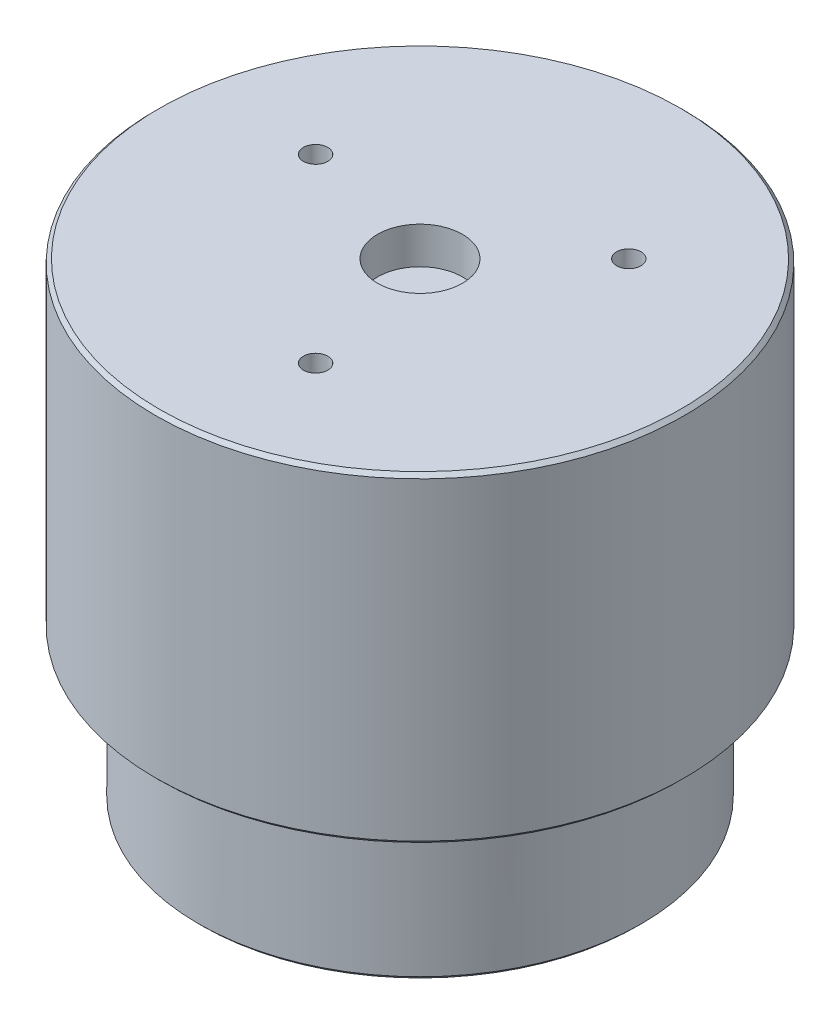
ISO-10303-21;
HEADER;
FILE_DESCRIPTION(('STEP AP214'),'2;1');
FILE_NAME('part.step','',(''),(''),'','','');
FILE_SCHEMA(('AUTOMOTIVE_DESIGN { 1 0 10303 214 1 1 1 1 }'));
ENDSEC;
DATA;
#1=APPLICATION_CONTEXT('core data for automotive mechanical design processes');
#2=APPLICATION_PROTOCOL_DEFINITION('international standard','automotive_design',2000,#1);
#3=PRODUCT_CONTEXT('',#1,'mechanical');
#4=PRODUCT('Part','Part','',(#3));
#5=PRODUCT_RELATED_PRODUCT_CATEGORY('part','',(#4));
#6=PRODUCT_DEFINITION_FORMATION('','',#4);
#7=PRODUCT_DEFINITION_CONTEXT('part definition',#1,'design');
#8=PRODUCT_DEFINITION('design','',#6,#7);
#9=PRODUCT_DEFINITION_SHAPE('','',#8);
#10=(LENGTH_UNIT() NAMED_UNIT(*) SI_UNIT(.MILLI.,.METRE.));
#11=(NAMED_UNIT(*) PLANE_ANGLE_UNIT() SI_UNIT($,.RADIAN.));
#12=(NAMED_UNIT(*) SI_UNIT($,.STERADIAN.) SOLID_ANGLE_UNIT());
#13=UNCERTAINTY_MEASURE_WITH_UNIT(LENGTH_MEASURE(1.E-05),#10,'distance_accuracy_value','');
#14=(GEOMETRIC_REPRESENTATION_CONTEXT(3) GLOBAL_UNCERTAINTY_ASSIGNED_CONTEXT((#13)) GLOBAL_UNIT_ASSIGNED_CONTEXT((#10,
#11,#12)) REPRESENTATION_CONTEXT('',''));
#15=CARTESIAN_POINT('',(0.,0.,0.));
#16=DIRECTION('',(0.,0.,1.));
#17=DIRECTION('',(1.,0.,0.));
#18=AXIS2_PLACEMENT_3D('',#15,#16,#17);
#19=CARTESIAN_POINT('',(0.,18.900368705809,-29.5));
#20=DIRECTION('',(0.,-1.,0.));
#21=DIRECTION('',(0.,0.,-1.));
#22=AXIS2_PLACEMENT_3D('',#19,#20,#21);
#23=PLANE('',#22);
#24=CARTESIAN_POINT('',(0.,18.900368705809,0.));
#25=DIRECTION('',(0.,1.,0.));
#26=DIRECTION('',(0.,0.,1.));
#27=AXIS2_PLACEMENT_3D('',#24,#25,#26);
#28=CIRCLE('',#27,29.5);
#29=CARTESIAN_POINT('',(0.,18.900368705809,29.5));
#30=VERTEX_POINT('',#29);
#31=EDGE_CURVE('E20',#30,#30,#28,.T.);
#32=ORIENTED_EDGE('',*,*,#31,.F.);
#33=EDGE_LOOP('',(#32));
#34=FACE_BOUND('',#33,.T.);
#35=ADVANCED_FACE('F17',(#34),#23,.T.);
#36=CARTESIAN_POINT('',(-19.3155992095119,70.900368705793,-5.17559920951214));
#37=DIRECTION('',(0.,1.,0.));
#38=DIRECTION('',(0.,0.,1.));
#39=AXIS2_PLACEMENT_3D('',#36,#37,#38);
#40=CONICAL_SURFACE('',#39,1.65000000004454,1.02974425870138);
#41=CARTESIAN_POINT('',(-19.3155992095119,69.9089486844287,-5.17559920951214));
#42=VERTEX_POINT('',#41);
#43=VERTEX_LOOP('',#42);
#44=FACE_BOUND('',#43,.T.);
#45=CARTESIAN_POINT('',(-19.3155992095119,70.900368705809,-5.17559920951214));
#46=DIRECTION('',(0.,1.,0.));
#47=DIRECTION('',(0.,0.,1.));
#48=AXIS2_PLACEMENT_3D('',#45,#46,#47);
#49=CIRCLE('',#48,1.65);
#50=CARTESIAN_POINT('',(-19.3155992095119,70.900368705809,-3.52559920951214));
#51=VERTEX_POINT('',#50);
#52=EDGE_CURVE('E42',#51,#51,#49,.T.);
#53=ORIENTED_EDGE('',*,*,#52,.T.);
#54=EDGE_LOOP('',(#53));
#55=FACE_BOUND('',#54,.T.);
#56=ADVANCED_FACE('F36',(#44,#55),#40,.F.);
#57=CARTESIAN_POINT('',(5.17559920951187,70.900368705793,19.315599209512));
#58=DIRECTION('',(0.,1.,0.));
#59=DIRECTION('',(0.,0.,1.));
#60=AXIS2_PLACEMENT_3D('',#57,#58,#59);
#61=CONICAL_SURFACE('',#60,1.64999999997749,1.02974425867096);
#62=CARTESIAN_POINT('',(5.17559920951187,69.9089486844002,19.3155992094551));
#63=VERTEX_POINT('',#62);
#64=VERTEX_LOOP('',#63);
#65=FACE_BOUND('',#64,.T.);
#66=CARTESIAN_POINT('',(5.17559920951187,70.900368705809,19.315599209512));
#67=DIRECTION('',(0.,1.,0.));
#68=DIRECTION('',(0.,0.,1.));
#69=AXIS2_PLACEMENT_3D('',#66,#67,#68);
#70=CIRCLE('',#69,1.65);
#71=CARTESIAN_POINT('',(5.17559920951187,70.900368705809,20.965599209512));
#72=VERTEX_POINT('',#71);
#73=EDGE_CURVE('E44',#72,#72,#70,.T.);
#74=ORIENTED_EDGE('',*,*,#73,.T.);
#75=EDGE_LOOP('',(#74));
#76=FACE_BOUND('',#75,.T.);
#77=ADVANCED_FACE('F39',(#65,#76),#61,.F.);
#78=CARTESIAN_POINT('',(14.14,70.900368705793,-14.14));
#79=DIRECTION('',(0.,1.,0.));
#80=DIRECTION('',(0.,0.,1.));
#81=AXIS2_PLACEMENT_3D('',#78,#79,#80);
#82=CONICAL_SURFACE('',#81,1.65000000004297,1.02974425867096);
#83=CARTESIAN_POINT('',(14.14,69.9089486843718,-14.1400000001137));
#84=VERTEX_POINT('',#83);
#85=VERTEX_LOOP('',#84);
#86=FACE_BOUND('',#85,.T.);
#87=CARTESIAN_POINT('',(14.14,70.900368705809,-14.14));
#88=DIRECTION('',(0.,1.,0.));
#89=DIRECTION('',(0.,0.,1.));
#90=AXIS2_PLACEMENT_3D('',#87,#88,#89);
#91=CIRCLE('',#90,1.65);
#92=CARTESIAN_POINT('',(14.14,70.900368705809,-12.49));
#93=VERTEX_POINT('',#92);
#94=EDGE_CURVE('E47',#93,#93,#91,.T.);
#95=ORIENTED_EDGE('',*,*,#94,.T.);
#96=EDGE_LOOP('',(#95));
#97=FACE_BOUND('',#96,.T.);
#98=ADVANCED_FACE('F285',(#86,#97),#82,.F.);
#99=CARTESIAN_POINT('',(0.,77.400368705809,0.));
#100=DIRECTION('',(0.,1.,0.));
#101=DIRECTION('',(0.,0.,1.));
#102=AXIS2_PLACEMENT_3D('',#99,#100,#101);
#103=PLANE('',#102);
#104=CARTESIAN_POINT('',(0.,77.400368705809,0.));
#105=DIRECTION('',(0.,1.,0.));
#106=DIRECTION('',(0.,0.,1.));
#107=AXIS2_PLACEMENT_3D('',#104,#105,#106);
#108=CIRCLE('',#107,5.75);
#109=CARTESIAN_POINT('',(0.,77.400368705809,5.75));
#110=VERTEX_POINT('',#109);
#111=EDGE_CURVE('E73',#110,#110,#108,.T.);
#112=ORIENTED_EDGE('',*,*,#111,.T.);
#113=EDGE_LOOP('',(#112));
#114=FACE_BOUND('',#113,.T.);
#115=ADVANCED_FACE('F122',(#114),#103,.T.);
#116=CARTESIAN_POINT('',(0.,19.400368705809,0.));
#117=DIRECTION('',(0.,1.,0.));
#118=DIRECTION('',(0.,0.,1.));
#119=AXIS2_PLACEMENT_3D('',#116,#117,#118);
#120=CONICAL_SURFACE('',#119,30.,0.785398163397448);
#121=ORIENTED_EDGE('',*,*,#31,.T.);
#122=EDGE_LOOP('',(#121));
#123=FACE_BOUND('',#122,.T.);
#124=CARTESIAN_POINT('',(0.,19.400368705809,0.));
#125=DIRECTION('',(0.,-1.,0.));
#126=DIRECTION('',(0.,0.,-1.));
#127=AXIS2_PLACEMENT_3D('',#124,#125,#126);
#128=CIRCLE('',#127,30.);
#129=CARTESIAN_POINT('',(0.,19.400368705809,-30.));
#130=VERTEX_POINT('',#129);
#131=EDGE_CURVE('E72',#130,#130,#128,.F.);
#132=ORIENTED_EDGE('',*,*,#131,.F.);
#133=EDGE_LOOP('',(#132));
#134=FACE_BOUND('',#133,.T.);
#135=ADVANCED_FACE('F112',(#123,#134),#120,.T.);
#136=CARTESIAN_POINT('',(-19.3155992095119,82.400368705809,-5.17559920951214));
#137=DIRECTION('',(0.,1.,0.));
#138=DIRECTION('',(0.,0.,1.));
#139=AXIS2_PLACEMENT_3D('',#136,#137,#138);
#140=CYLINDRICAL_SURFACE('',#139,1.65);
#141=CARTESIAN_POINT('',(-19.3155992095119,82.400368705809,-5.17559920951214));
#142=DIRECTION('',(0.,1.,0.));
#143=DIRECTION('',(0.,0.,1.));
#144=AXIS2_PLACEMENT_3D('',#141,#142,#143);
#145=CIRCLE('',#144,1.65);
#146=CARTESIAN_POINT('',(-19.3155992095119,82.400368705809,-3.52559920951214));
#147=VERTEX_POINT('',#146);
#148=EDGE_CURVE('E70',#147,#147,#145,.F.);
#149=ORIENTED_EDGE('',*,*,#148,.F.);
#150=EDGE_LOOP('',(#149));
#151=FACE_BOUND('',#150,.T.);
#152=ORIENTED_EDGE('',*,*,#52,.F.);
#153=EDGE_LOOP('',(#152));
#154=FACE_BOUND('',#153,.T.);
#155=ADVANCED_FACE('F109',(#151,#154),#140,.F.);
#156=CARTESIAN_POINT('',(5.17559920951187,82.400368705809,19.315599209512));
#157=DIRECTION('',(0.,1.,0.));
#158=DIRECTION('',(0.,0.,1.));
#159=AXIS2_PLACEMENT_3D('',#156,#157,#158);
#160=CYLINDRICAL_SURFACE('',#159,1.65);
#161=CARTESIAN_POINT('',(5.17559920951187,82.400368705809,19.315599209512));
#162=DIRECTION('',(0.,1.,0.));
#163=DIRECTION('',(0.,0.,1.));
#164=AXIS2_PLACEMENT_3D('',#161,#162,#163);
#165=CIRCLE('',#164,1.65);
#166=CARTESIAN_POINT('',(5.17559920951187,82.400368705809,20.965599209512));
#167=VERTEX_POINT('',#166);
#168=EDGE_CURVE('E67',#167,#167,#165,.F.);
#169=ORIENTED_EDGE('',*,*,#168,.F.);
#170=EDGE_LOOP('',(#169));
#171=FACE_BOUND('',#170,.T.);
#172=ORIENTED_EDGE('',*,*,#73,.F.);
#173=EDGE_LOOP('',(#172));
#174=FACE_BOUND('',#173,.T.);
#175=ADVANCED_FACE('F111',(#171,#174),#160,.F.);
#176=CARTESIAN_POINT('',(14.14,82.400368705809,-14.14));
#177=DIRECTION('',(0.,1.,0.));
#178=DIRECTION('',(0.,0.,1.));
#179=AXIS2_PLACEMENT_3D('',#176,#177,#178);
#180=CYLINDRICAL_SURFACE('',#179,1.65);
#181=CARTESIAN_POINT('',(14.14,82.400368705809,-14.14));
#182=DIRECTION('',(0.,1.,0.));
#183=DIRECTION('',(0.,0.,1.));
#184=AXIS2_PLACEMENT_3D('',#181,#182,#183);
#185=CIRCLE('',#184,1.65);
#186=CARTESIAN_POINT('',(14.14,82.400368705809,-12.49));
#187=VERTEX_POINT('',#186);
#188=EDGE_CURVE('E64',#187,#187,#185,.F.);
#189=ORIENTED_EDGE('',*,*,#188,.F.);
#190=EDGE_LOOP('',(#189));
#191=FACE_BOUND('',#190,.T.);
#192=ORIENTED_EDGE('',*,*,#94,.F.);
#193=EDGE_LOOP('',(#192));
#194=FACE_BOUND('',#193,.T.);
#195=ADVANCED_FACE('F119',(#191,#194),#180,.F.);
#196=CARTESIAN_POINT('',(0.,77.400368705809,0.));
#197=DIRECTION('',(0.,1.,0.));
#198=DIRECTION('',(0.,0.,1.));
#199=AXIS2_PLACEMENT_3D('',#196,#197,#198);
#200=CYLINDRICAL_SURFACE('',#199,5.75);
#201=CARTESIAN_POINT('',(0.,82.400368705809,0.));
#202=DIRECTION('',(0.,1.,0.));
#203=DIRECTION('',(0.,0.,1.));
#204=AXIS2_PLACEMENT_3D('',#201,#202,#203);
#205=CIRCLE('',#204,5.75);
#206=CARTESIAN_POINT('',(0.,82.400368705809,5.75));
#207=VERTEX_POINT('',#206);
#208=EDGE_CURVE('E61',#207,#207,#205,.F.);
#209=ORIENTED_EDGE('',*,*,#208,.F.);
#210=EDGE_LOOP('',(#209));
#211=FACE_BOUND('',#210,.T.);
#212=ORIENTED_EDGE('',*,*,#111,.F.);
#213=EDGE_LOOP('',(#212));
#214=FACE_BOUND('',#213,.T.);
#215=ADVANCED_FACE('F139',(#211,#214),#200,.F.);
#216=CARTESIAN_POINT('',(0.,0.,0.));
#217=DIRECTION('',(0.,-1.,0.));
#218=DIRECTION('',(0.,0.,-1.));
#219=AXIS2_PLACEMENT_3D('',#216,#217,#218);
#220=CYLINDRICAL_SURFACE('',#219,30.);
#221=CARTESIAN_POINT('',(0.,38.900368705809,0.));
#222=DIRECTION('',(0.,-1.,0.));
#223=DIRECTION('',(0.,0.,-1.));
#224=AXIS2_PLACEMENT_3D('',#221,#222,#223);
#225=CIRCLE('',#224,30.);
#226=CARTESIAN_POINT('',(0.,38.900368705809,-30.));
#227=VERTEX_POINT('',#226);
#228=EDGE_CURVE('E58',#227,#227,#225,.F.);
#229=ORIENTED_EDGE('',*,*,#228,.F.);
#230=EDGE_LOOP('',(#229));
#231=FACE_BOUND('',#230,.T.);
#232=ORIENTED_EDGE('',*,*,#131,.T.);
#233=EDGE_LOOP('',(#232));
#234=FACE_BOUND('',#233,.T.);
#235=ADVANCED_FACE('F99',(#231,#234),#220,.T.);
#236=CARTESIAN_POINT('',(0.,82.400368705809,-5.75));
#237=DIRECTION('',(0.,1.,0.));
#238=DIRECTION('',(0.,0.,1.));
#239=AXIS2_PLACEMENT_3D('',#236,#237,#238);
#240=PLANE('',#239);
#241=CARTESIAN_POINT('',(0.,82.400368705809,0.));
#242=DIRECTION('',(0.,-1.,0.));
#243=DIRECTION('',(0.,0.,-1.));
#244=AXIS2_PLACEMENT_3D('',#241,#242,#243);
#245=CIRCLE('',#244,35.3);
#246=CARTESIAN_POINT('',(0.,82.400368705809,-35.3));
#247=VERTEX_POINT('',#246);
#248=EDGE_CURVE('E55',#247,#247,#245,.T.);
#249=ORIENTED_EDGE('',*,*,#248,.F.);
#250=EDGE_LOOP('',(#249));
#251=FACE_BOUND('',#250,.T.);
#252=ORIENTED_EDGE('',*,*,#208,.T.);
#253=EDGE_LOOP('',(#252));
#254=FACE_BOUND('',#253,.T.);
#255=ORIENTED_EDGE('',*,*,#188,.T.);
#256=EDGE_LOOP('',(#255));
#257=FACE_BOUND('',#256,.T.);
#258=ORIENTED_EDGE('',*,*,#168,.T.);
#259=EDGE_LOOP('',(#258));
#260=FACE_BOUND('',#259,.T.);
#261=ORIENTED_EDGE('',*,*,#148,.T.);
#262=EDGE_LOOP('',(#261));
#263=FACE_BOUND('',#262,.T.);
#264=ADVANCED_FACE('F96',(#251,#254,#257,#260,#263),#240,.T.);
#265=CARTESIAN_POINT('',(0.,38.900368705809,-30.));
#266=DIRECTION('',(0.,-1.,0.));
#267=DIRECTION('',(0.,0.,-1.));
#268=AXIS2_PLACEMENT_3D('',#265,#266,#267);
#269=PLANE('',#268);
#270=ORIENTED_EDGE('',*,*,#228,.T.);
#271=EDGE_LOOP('',(#270));
#272=FACE_BOUND('',#271,.T.);
#273=CARTESIAN_POINT('',(0.,38.900368705809,0.));
#274=DIRECTION('',(0.,1.,0.));
#275=DIRECTION('',(0.,0.,1.));
#276=AXIS2_PLACEMENT_3D('',#273,#274,#275);
#277=CIRCLE('',#276,35.3);
#278=CARTESIAN_POINT('',(0.,38.900368705809,35.3));
#279=VERTEX_POINT('',#278);
#280=EDGE_CURVE('E52',#279,#279,#277,.T.);
#281=ORIENTED_EDGE('',*,*,#280,.F.);
#282=EDGE_LOOP('',(#281));
#283=FACE_BOUND('',#282,.T.);
#284=ADVANCED_FACE('F92',(#272,#283),#269,.T.);
#285=CARTESIAN_POINT('',(0.,81.900368705809,0.));
#286=DIRECTION('',(0.,-1.,0.));
#287=DIRECTION('',(0.,0.,-1.));
#288=AXIS2_PLACEMENT_3D('',#285,#286,#287);
#289=CONICAL_SURFACE('',#288,35.8,0.785398163397448);
#290=CARTESIAN_POINT('',(0.,81.900368705809,0.));
#291=DIRECTION('',(0.,-1.,0.));
#292=DIRECTION('',(0.,0.,-1.));
#293=AXIS2_PLACEMENT_3D('',#290,#291,#292);
#294=CIRCLE('',#293,35.8);
#295=CARTESIAN_POINT('',(0.,81.900368705809,-35.8));
#296=VERTEX_POINT('',#295);
#297=EDGE_CURVE('E26',#296,#296,#294,.T.);
#298=ORIENTED_EDGE('',*,*,#297,.F.);
#299=EDGE_LOOP('',(#298));
#300=FACE_BOUND('',#299,.T.);
#301=ORIENTED_EDGE('',*,*,#248,.T.);
#302=EDGE_LOOP('',(#301));
#303=FACE_BOUND('',#302,.T.);
#304=ADVANCED_FACE('F88',(#300,#303),#289,.T.);
#305=CARTESIAN_POINT('',(0.,39.400368705809,0.));
#306=DIRECTION('',(0.,1.,0.));
#307=DIRECTION('',(0.,0.,1.));
#308=AXIS2_PLACEMENT_3D('',#305,#306,#307);
#309=CONICAL_SURFACE('',#308,35.8,0.785398163397448);
#310=CARTESIAN_POINT('',(0.,39.400368705809,0.));
#311=DIRECTION('',(0.,-1.,0.));
#312=DIRECTION('',(0.,0.,-1.));
#313=AXIS2_PLACEMENT_3D('',#310,#311,#312);
#314=CIRCLE('',#313,35.8);
#315=CARTESIAN_POINT('',(0.,39.400368705809,-35.8));
#316=VERTEX_POINT('',#315);
#317=EDGE_CURVE('E11',#316,#316,#314,.F.);
#318=ORIENTED_EDGE('',*,*,#317,.F.);
#319=EDGE_LOOP('',(#318));
#320=FACE_BOUND('',#319,.T.);
#321=ORIENTED_EDGE('',*,*,#280,.T.);
#322=EDGE_LOOP('',(#321));
#323=FACE_BOUND('',#322,.T.);
#324=ADVANCED_FACE('F91',(#320,#323),#309,.T.);
#325=CARTESIAN_POINT('',(0.,0.,0.));
#326=DIRECTION('',(0.,-1.,0.));
#327=DIRECTION('',(0.,0.,-1.));
#328=AXIS2_PLACEMENT_3D('',#325,#326,#327);
#329=CYLINDRICAL_SURFACE('',#328,35.8);
#330=ORIENTED_EDGE('',*,*,#317,.T.);
#331=EDGE_LOOP('',(#330));
#332=FACE_BOUND('',#331,.T.);
#333=ORIENTED_EDGE('',*,*,#297,.T.);
#334=EDGE_LOOP('',(#333));
#335=FACE_BOUND('',#334,.T.);
#336=ADVANCED_FACE('F86',(#332,#335),#329,.T.);
#337=CLOSED_SHELL('',(#35,#56,#77,#98,#115,#135,#155,#175,#195,#215,#235,#264,#284,#304,#324,#336));
#338=MANIFOLD_SOLID_BREP('B1',#337);
#339=ADVANCED_BREP_SHAPE_REPRESENTATION('',(#18,#338),#14);
#340=SHAPE_DEFINITION_REPRESENTATION(#9,#339);
ENDSEC;
END-ISO-10303-21;
